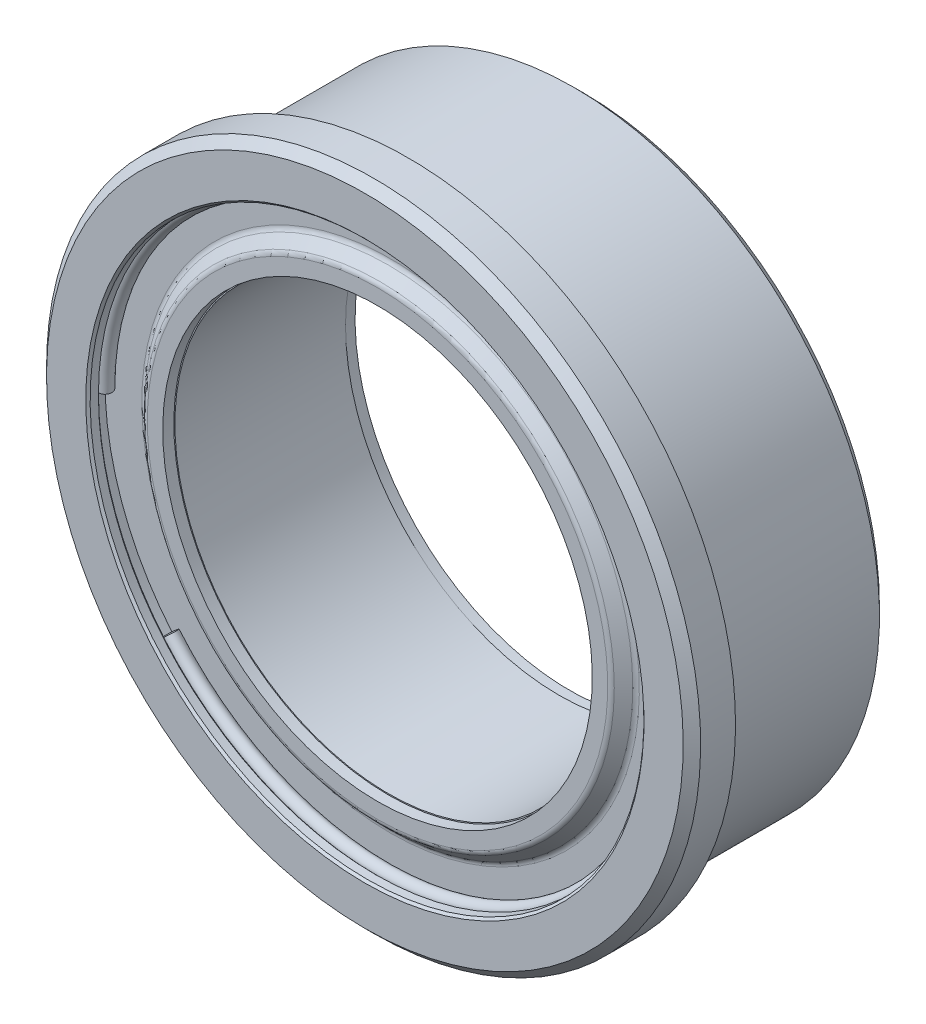
ISO-10303-21;
HEADER;
FILE_DESCRIPTION(('STEP AP214'),'2;1');
FILE_NAME('part.step','',(''),(''),'','','');
FILE_SCHEMA(('AUTOMOTIVE_DESIGN { 1 0 10303 214 1 1 1 1 }'));
ENDSEC;
DATA;
#1=APPLICATION_CONTEXT('core data for automotive mechanical design processes');
#2=APPLICATION_PROTOCOL_DEFINITION('international standard','automotive_design',2000,#1);
#3=PRODUCT_CONTEXT('',#1,'mechanical');
#4=PRODUCT('Part','Part','',(#3));
#5=PRODUCT_RELATED_PRODUCT_CATEGORY('part','',(#4));
#6=PRODUCT_DEFINITION_FORMATION('','',#4);
#7=PRODUCT_DEFINITION_CONTEXT('part definition',#1,'design');
#8=PRODUCT_DEFINITION('design','',#6,#7);
#9=PRODUCT_DEFINITION_SHAPE('','',#8);
#10=(LENGTH_UNIT() NAMED_UNIT(*) SI_UNIT(.MILLI.,.METRE.));
#11=(NAMED_UNIT(*) PLANE_ANGLE_UNIT() SI_UNIT($,.RADIAN.));
#12=(NAMED_UNIT(*) SI_UNIT($,.STERADIAN.) SOLID_ANGLE_UNIT());
#13=UNCERTAINTY_MEASURE_WITH_UNIT(LENGTH_MEASURE(1.E-05),#10,'distance_accuracy_value','');
#14=(GEOMETRIC_REPRESENTATION_CONTEXT(3) GLOBAL_UNCERTAINTY_ASSIGNED_CONTEXT((#13)) GLOBAL_UNIT_ASSIGNED_CONTEXT((#10,
#11,#12)) REPRESENTATION_CONTEXT('',''));
#15=CARTESIAN_POINT('',(0.,0.,0.));
#16=DIRECTION('',(0.,0.,1.));
#17=DIRECTION('',(1.,0.,0.));
#18=AXIS2_PLACEMENT_3D('',#15,#16,#17);
#19=CARTESIAN_POINT('',(0.,0.,4.71));
#20=DIRECTION('',(0.,0.,1.));
#21=DIRECTION('',(0.,-1.,0.));
#22=AXIS2_PLACEMENT_3D('',#19,#20,#21);
#23=CYLINDRICAL_SURFACE('',#22,4.9);
#24=CARTESIAN_POINT('',(0.,0.,0.544));
#25=DIRECTION('',(0.,0.,-1.));
#26=DIRECTION('',(-1.,0.,0.));
#27=AXIS2_PLACEMENT_3D('',#24,#25,#26);
#28=CIRCLE('',#27,4.9);
#29=CARTESIAN_POINT('',(-4.9,0.,0.544));
#30=VERTEX_POINT('',#29);
#31=EDGE_CURVE('E35',#30,#30,#28,.T.);
#32=ORIENTED_EDGE('',*,*,#31,.T.);
#33=EDGE_LOOP('',(#32));
#34=FACE_BOUND('',#33,.T.);
#35=CARTESIAN_POINT('',(0.,0.,4.456));
#36=DIRECTION('',(0.,0.,1.));
#37=DIRECTION('',(1.,0.,0.));
#38=AXIS2_PLACEMENT_3D('',#35,#36,#37);
#39=CIRCLE('',#38,4.9);
#40=CARTESIAN_POINT('',(4.9,0.,4.456));
#41=VERTEX_POINT('',#40);
#42=EDGE_CURVE('E42',#41,#41,#39,.T.);
#43=ORIENTED_EDGE('',*,*,#42,.T.);
#44=EDGE_LOOP('',(#43));
#45=FACE_BOUND('',#44,.T.);
#46=ADVANCED_FACE('F17',(#34,#45),#23,.F.);
#47=CARTESIAN_POINT('',(0.,0.,5.));
#48=DIRECTION('',(0.,-1.,0.));
#49=DIRECTION('',(0.,0.,-1.));
#50=AXIS2_PLACEMENT_3D('',#47,#48,#49);
#51=PLANE('',#50);
#52=CARTESIAN_POINT('',(-6.4,0.,0.44));
#53=DIRECTION('',(0.,1.,0.));
#54=DIRECTION('',(1.,0.,0.));
#55=AXIS2_PLACEMENT_3D('',#52,#53,#54);
#56=CIRCLE('',#55,0.16);
#57=CARTESIAN_POINT('',(-6.3443223563717,0.,0.59));
#58=VERTEX_POINT('',#57);
#59=CARTESIAN_POINT('',(-6.39029462827223,0.,0.280294628269161));
#60=VERTEX_POINT('',#59);
#61=EDGE_CURVE('E449',#58,#60,#56,.T.);
#62=ORIENTED_EDGE('',*,*,#61,.F.);
#63=DIRECTION('',(-1.,0.,0.));
#64=VECTOR('',#63,1.);
#65=CARTESIAN_POINT('',(0.,0.,0.59));
#66=LINE('',#65,#64);
#67=CARTESIAN_POINT('',(-6.4556776436283,0.,0.59));
#68=VERTEX_POINT('',#67);
#69=EDGE_CURVE('E360',#58,#68,#66,.T.);
#70=ORIENTED_EDGE('',*,*,#69,.T.);
#71=CARTESIAN_POINT('',(-6.4,0.,0.44));
#72=DIRECTION('',(0.,1.,0.));
#73=DIRECTION('',(1.,0.,0.));
#74=AXIS2_PLACEMENT_3D('',#71,#72,#73);
#75=CIRCLE('',#74,0.16);
#76=CARTESIAN_POINT('',(-6.55,0.,0.4956776436283));
#77=VERTEX_POINT('',#76);
#78=EDGE_CURVE('E288',#77,#68,#75,.T.);
#79=ORIENTED_EDGE('',*,*,#78,.F.);
#80=DIRECTION('',(0.,0.,1.));
#81=VECTOR('',#80,1.);
#82=CARTESIAN_POINT('',(-6.55,0.,0.59));
#83=LINE('',#82,#81);
#84=CARTESIAN_POINT('',(-6.55,0.,0.3843223563717));
#85=VERTEX_POINT('',#84);
#86=EDGE_CURVE('E412',#85,#77,#83,.T.);
#87=ORIENTED_EDGE('',*,*,#86,.F.);
#88=CARTESIAN_POINT('',(-6.4,0.,0.44));
#89=DIRECTION('',(0.,1.,0.));
#90=DIRECTION('',(1.,0.,0.));
#91=AXIS2_PLACEMENT_3D('',#88,#89,#90);
#92=CIRCLE('',#91,0.16);
#93=CARTESIAN_POINT('',(-6.4556776436283,0.,0.29));
#94=VERTEX_POINT('',#93);
#95=EDGE_CURVE('E415',#94,#85,#92,.T.);
#96=ORIENTED_EDGE('',*,*,#95,.F.);
#97=DIRECTION('',(-1.,0.,0.));
#98=VECTOR('',#97,1.);
#99=CARTESIAN_POINT('',(0.,0.,0.29));
#100=LINE('',#99,#98);
#101=CARTESIAN_POINT('',(-6.400000000005,0.,0.29));
#102=VERTEX_POINT('',#101);
#103=EDGE_CURVE('E361',#102,#94,#100,.T.);
#104=ORIENTED_EDGE('',*,*,#103,.F.);
#105=DIRECTION('',(-0.707106781186553,0.,0.707106781186542));
#106=VECTOR('',#105,1.);
#107=CARTESIAN_POINT('',(0.,0.,-6.10999999999989));
#108=LINE('',#107,#106);
#109=EDGE_CURVE('E333',#60,#102,#108,.T.);
#110=ORIENTED_EDGE('',*,*,#109,.F.);
#111=EDGE_LOOP('',(#62,#70,#79,#87,#96,#104,#110));
#112=FACE_BOUND('',#111,.T.);
#113=ADVANCED_FACE('F462',(#112),#51,.T.);
#114=CARTESIAN_POINT('',(0.,0.,0.));
#115=DIRECTION('',(0.64278760968653,-0.766044443118986,0.));
#116=DIRECTION('',(0.,0.,-1.));
#117=AXIS2_PLACEMENT_3D('',#114,#115,#116);
#118=PLANE('',#117);
#119=CARTESIAN_POINT('',(-4.90268443595996,-4.11384070199564,4.56));
#120=DIRECTION('',(0.642787609686818,-0.766044443118744,0.));
#121=DIRECTION('',(-0.766044443118744,-0.642787609686818,0.));
#122=AXIS2_PLACEMENT_3D('',#119,#120,#121);
#123=CIRCLE('',#122,0.16);
#124=CARTESIAN_POINT('',(-4.86003288645256,-4.07805180253481,4.41));
#125=VERTEX_POINT('',#124);
#126=CARTESIAN_POINT('',(-4.89524968987952,-4.10760220930164,4.71970537173084));
#127=VERTEX_POINT('',#126);
#128=EDGE_CURVE('E276',#125,#127,#123,.T.);
#129=ORIENTED_EDGE('',*,*,#128,.F.);
#130=DIRECTION('',(-0.766044443113703,-0.642787609692826,0.));
#131=VECTOR('',#130,1.);
#132=CARTESIAN_POINT('',(-3.30193986651628E-11,3.93509869838523E-11,4.41));
#133=LINE('',#132,#131);
#134=CARTESIAN_POINT('',(-4.94533598546709,-4.1496296014568,4.41));
#135=VERTEX_POINT('',#134);
#136=EDGE_CURVE('E378',#125,#135,#133,.T.);
#137=ORIENTED_EDGE('',*,*,#136,.T.);
#138=CARTESIAN_POINT('',(-4.90268443595996,-4.11384070199564,4.56));
#139=DIRECTION('',(0.642787609686818,-0.766044443118744,0.));
#140=DIRECTION('',(-0.766044443118744,-0.642787609686818,0.));
#141=AXIS2_PLACEMENT_3D('',#138,#139,#140);
#142=CIRCLE('',#141,0.16);
#143=CARTESIAN_POINT('',(-5.01759110242777,-4.21025884344866,4.5043223563717));
#144=VERTEX_POINT('',#143);
#145=EDGE_CURVE('E11',#144,#135,#142,.T.);
#146=ORIENTED_EDGE('',*,*,#145,.F.);
#147=DIRECTION('',(0.,0.,-1.));
#148=VECTOR('',#147,1.);
#149=CARTESIAN_POINT('',(-5.01759110242778,-4.21025884344866,4.41));
#150=LINE('',#149,#148);
#151=CARTESIAN_POINT('',(-5.01759110242777,-4.21025884344866,4.6156776436283));
#152=VERTEX_POINT('',#151);
#153=EDGE_CURVE('E328',#152,#144,#150,.T.);
#154=ORIENTED_EDGE('',*,*,#153,.F.);
#155=CARTESIAN_POINT('',(-4.90268443595996,-4.11384070199564,4.56));
#156=DIRECTION('',(0.642787609686818,-0.766044443118744,0.));
#157=DIRECTION('',(-0.766044443118744,-0.642787609686818,0.));
#158=AXIS2_PLACEMENT_3D('',#155,#156,#157);
#159=CIRCLE('',#158,0.16);
#160=CARTESIAN_POINT('',(-4.94533598546737,-4.14962960145647,4.71));
#161=VERTEX_POINT('',#160);
#162=EDGE_CURVE('E25',#161,#152,#159,.T.);
#163=ORIENTED_EDGE('',*,*,#162,.F.);
#164=DIRECTION('',(-0.766044443113703,-0.642787609692826,0.));
#165=VECTOR('',#164,1.);
#166=CARTESIAN_POINT('',(-3.30193986651628E-11,3.93509869838523E-11,4.71));
#167=LINE('',#166,#165);
#168=CARTESIAN_POINT('',(-4.90268443596611,-4.11384070199927,4.71000000001205));
#169=VERTEX_POINT('',#168);
#170=EDGE_CURVE('E294',#169,#161,#167,.T.);
#171=ORIENTED_EDGE('',*,*,#170,.F.);
#172=DIRECTION('',(-0.541675220415967,-0.454519477676485,-0.707106781186554));
#173=VECTOR('',#172,1.);
#174=CARTESIAN_POINT('',(-3.30193986651628E-11,3.93509869838523E-11,11.11));
#175=LINE('',#174,#173);
#176=EDGE_CURVE('E291',#127,#169,#175,.T.);
#177=ORIENTED_EDGE('',*,*,#176,.F.);
#178=EDGE_LOOP('',(#129,#137,#146,#154,#163,#171,#177));
#179=FACE_BOUND('',#178,.T.);
#180=ADVANCED_FACE('F292',(#179),#118,.F.);
#181=CARTESIAN_POINT('',(0.,0.,4.56));
#182=DIRECTION('',(0.,0.,1.));
#183=DIRECTION('',(0.,-1.,0.));
#184=AXIS2_PLACEMENT_3D('',#181,#182,#183);
#185=TOROIDAL_SURFACE('',#184,6.4,0.16);
#186=CARTESIAN_POINT('',(0.,0.,4.5043223563717));
#187=DIRECTION('',(0.,0.,1.));
#188=DIRECTION('',(1.,0.,0.));
#189=AXIS2_PLACEMENT_3D('',#186,#187,#188);
#190=CIRCLE('',#189,6.55);
#191=CARTESIAN_POINT('',(-6.55,0.,4.5043223563717));
#192=VERTEX_POINT('',#191);
#193=EDGE_CURVE('E329',#144,#192,#190,.T.);
#194=ORIENTED_EDGE('',*,*,#193,.F.);
#195=ORIENTED_EDGE('',*,*,#145,.T.);
#196=CARTESIAN_POINT('',(0.,0.,4.41));
#197=DIRECTION('',(0.,0.,1.));
#198=DIRECTION('',(1.,0.,0.));
#199=AXIS2_PLACEMENT_3D('',#196,#197,#198);
#200=CIRCLE('',#199,6.4556776436283);
#201=CARTESIAN_POINT('',(-6.4556776436283,0.,4.41));
#202=VERTEX_POINT('',#201);
#203=EDGE_CURVE('E400',#135,#202,#200,.T.);
#204=ORIENTED_EDGE('',*,*,#203,.T.);
#205=CARTESIAN_POINT('',(-6.4,0.,4.56));
#206=DIRECTION('',(0.,-1.,0.));
#207=DIRECTION('',(-1.,0.,0.));
#208=AXIS2_PLACEMENT_3D('',#205,#206,#207);
#209=CIRCLE('',#208,0.16);
#210=EDGE_CURVE('E511',#192,#202,#209,.T.);
#211=ORIENTED_EDGE('',*,*,#210,.F.);
#212=EDGE_LOOP('',(#194,#195,#204,#211));
#213=FACE_BOUND('',#212,.T.);
#214=ADVANCED_FACE('F590',(#213),#185,.T.);
#215=CARTESIAN_POINT('',(0.,0.,4.56));
#216=DIRECTION('',(0.,0.,1.));
#217=DIRECTION('',(0.,-1.,0.));
#218=AXIS2_PLACEMENT_3D('',#215,#216,#217);
#219=TOROIDAL_SURFACE('',#218,6.4,0.16);
#220=CARTESIAN_POINT('',(0.,0.,4.6156776436283));
#221=DIRECTION('',(0.,0.,-1.));
#222=DIRECTION('',(-1.,0.,0.));
#223=AXIS2_PLACEMENT_3D('',#220,#221,#222);
#224=CIRCLE('',#223,6.55);
#225=CARTESIAN_POINT('',(-6.55,0.,4.6156776436283));
#226=VERTEX_POINT('',#225);
#227=EDGE_CURVE('E324',#226,#152,#224,.T.);
#228=ORIENTED_EDGE('',*,*,#227,.F.);
#229=CARTESIAN_POINT('',(-6.4,0.,4.56));
#230=DIRECTION('',(0.,-1.,0.));
#231=DIRECTION('',(-1.,0.,0.));
#232=AXIS2_PLACEMENT_3D('',#229,#230,#231);
#233=CIRCLE('',#232,0.16);
#234=CARTESIAN_POINT('',(-6.4556776436283,0.,4.71));
#235=VERTEX_POINT('',#234);
#236=EDGE_CURVE('E512',#235,#226,#233,.T.);
#237=ORIENTED_EDGE('',*,*,#236,.F.);
#238=CARTESIAN_POINT('',(0.,0.,4.71));
#239=DIRECTION('',(0.,0.,1.));
#240=DIRECTION('',(1.,0.,0.));
#241=AXIS2_PLACEMENT_3D('',#238,#239,#240);
#242=CIRCLE('',#241,6.4556776436283);
#243=EDGE_CURVE('E431',#161,#235,#242,.T.);
#244=ORIENTED_EDGE('',*,*,#243,.F.);
#245=ORIENTED_EDGE('',*,*,#162,.T.);
#246=EDGE_LOOP('',(#228,#237,#244,#245));
#247=FACE_BOUND('',#246,.T.);
#248=ADVANCED_FACE('F593',(#247),#219,.T.);
#249=CARTESIAN_POINT('',(0.,0.,4.56));
#250=DIRECTION('',(0.,0.,1.));
#251=DIRECTION('',(0.,-1.,0.));
#252=AXIS2_PLACEMENT_3D('',#249,#250,#251);
#253=TOROIDAL_SURFACE('',#252,6.4,0.16);
#254=CARTESIAN_POINT('',(0.,0.,4.71970537173084));
#255=DIRECTION('',(0.,0.,-1.));
#256=DIRECTION('',(-1.,0.,0.));
#257=AXIS2_PLACEMENT_3D('',#254,#255,#256);
#258=CIRCLE('',#257,6.39029462826916);
#259=CARTESIAN_POINT('',(-6.39029462827226,0.,4.71970537173084));
#260=VERTEX_POINT('',#259);
#261=EDGE_CURVE('E281',#260,#127,#258,.T.);
#262=ORIENTED_EDGE('',*,*,#261,.F.);
#263=CARTESIAN_POINT('',(-6.4,0.,4.56));
#264=DIRECTION('',(0.,-1.,0.));
#265=DIRECTION('',(-1.,0.,0.));
#266=AXIS2_PLACEMENT_3D('',#263,#264,#265);
#267=CIRCLE('',#266,0.16);
#268=CARTESIAN_POINT('',(-6.3443223563717,0.,4.41));
#269=VERTEX_POINT('',#268);
#270=EDGE_CURVE('E535',#269,#260,#267,.T.);
#271=ORIENTED_EDGE('',*,*,#270,.F.);
#272=CARTESIAN_POINT('',(0.,0.,4.41));
#273=DIRECTION('',(0.,0.,-1.));
#274=DIRECTION('',(-1.,0.,0.));
#275=AXIS2_PLACEMENT_3D('',#272,#273,#274);
#276=CIRCLE('',#275,6.3443223563717);
#277=EDGE_CURVE('E283',#269,#125,#276,.T.);
#278=ORIENTED_EDGE('',*,*,#277,.T.);
#279=ORIENTED_EDGE('',*,*,#128,.T.);
#280=EDGE_LOOP('',(#262,#271,#278,#279));
#281=FACE_BOUND('',#280,.T.);
#282=ADVANCED_FACE('F278',(#281),#253,.T.);
#283=CARTESIAN_POINT('',(0.,0.,0.44));
#284=DIRECTION('',(0.,0.,-1.));
#285=DIRECTION('',(0.,-1.,0.));
#286=AXIS2_PLACEMENT_3D('',#283,#284,#285);
#287=TOROIDAL_SURFACE('',#286,6.4,0.16);
#288=CARTESIAN_POINT('',(0.,0.,0.4956776436283));
#289=DIRECTION('',(0.,0.,-1.));
#290=DIRECTION('',(-1.,0.,0.));
#291=AXIS2_PLACEMENT_3D('',#288,#289,#290);
#292=CIRCLE('',#291,6.55);
#293=CARTESIAN_POINT('',(-5.01759110242777,-4.21025884344866,0.4956776436283));
#294=VERTEX_POINT('',#293);
#295=EDGE_CURVE('E405',#77,#294,#292,.T.);
#296=ORIENTED_EDGE('',*,*,#295,.F.);
#297=ORIENTED_EDGE('',*,*,#78,.T.);
#298=CARTESIAN_POINT('',(0.,0.,0.59));
#299=DIRECTION('',(0.,0.,-1.));
#300=DIRECTION('',(-1.,0.,0.));
#301=AXIS2_PLACEMENT_3D('',#298,#299,#300);
#302=CIRCLE('',#301,6.4556776436283);
#303=CARTESIAN_POINT('',(-4.94533598546737,-4.14962960145647,0.59));
#304=VERTEX_POINT('',#303);
#305=EDGE_CURVE('E365',#68,#304,#302,.T.);
#306=ORIENTED_EDGE('',*,*,#305,.T.);
#307=CARTESIAN_POINT('',(-4.90268443595996,-4.11384070199564,0.44));
#308=DIRECTION('',(-0.642787609686818,0.766044443118744,0.));
#309=DIRECTION('',(0.766044443118744,0.642787609686818,0.));
#310=AXIS2_PLACEMENT_3D('',#307,#308,#309);
#311=CIRCLE('',#310,0.16);
#312=EDGE_CURVE('E475',#294,#304,#311,.T.);
#313=ORIENTED_EDGE('',*,*,#312,.F.);
#314=EDGE_LOOP('',(#296,#297,#306,#313));
#315=FACE_BOUND('',#314,.T.);
#316=ADVANCED_FACE('F599',(#315),#287,.T.);
#317=CARTESIAN_POINT('',(0.,0.,0.44));
#318=DIRECTION('',(0.,0.,-1.));
#319=DIRECTION('',(0.,-1.,0.));
#320=AXIS2_PLACEMENT_3D('',#317,#318,#319);
#321=TOROIDAL_SURFACE('',#320,6.4,0.16);
#322=CARTESIAN_POINT('',(0.,0.,0.3843223563717));
#323=DIRECTION('',(0.,0.,1.));
#324=DIRECTION('',(1.,0.,0.));
#325=AXIS2_PLACEMENT_3D('',#322,#323,#324);
#326=CIRCLE('',#325,6.55);
#327=CARTESIAN_POINT('',(-5.01759110242777,-4.21025884344866,0.3843223563717));
#328=VERTEX_POINT('',#327);
#329=EDGE_CURVE('E408',#328,#85,#326,.T.);
#330=ORIENTED_EDGE('',*,*,#329,.F.);
#331=CARTESIAN_POINT('',(-4.90268443595996,-4.11384070199564,0.44));
#332=DIRECTION('',(-0.642787609686818,0.766044443118744,0.));
#333=DIRECTION('',(0.766044443118744,0.642787609686818,0.));
#334=AXIS2_PLACEMENT_3D('',#331,#332,#333);
#335=CIRCLE('',#334,0.16);
#336=CARTESIAN_POINT('',(-4.94533598546737,-4.14962960145647,0.29));
#337=VERTEX_POINT('',#336);
#338=EDGE_CURVE('E476',#337,#328,#335,.T.);
#339=ORIENTED_EDGE('',*,*,#338,.F.);
#340=CARTESIAN_POINT('',(0.,0.,0.29));
#341=DIRECTION('',(0.,0.,-1.));
#342=DIRECTION('',(-1.,0.,0.));
#343=AXIS2_PLACEMENT_3D('',#340,#341,#342);
#344=CIRCLE('',#343,6.4556776436283);
#345=EDGE_CURVE('E366',#94,#337,#344,.T.);
#346=ORIENTED_EDGE('',*,*,#345,.F.);
#347=ORIENTED_EDGE('',*,*,#95,.T.);
#348=EDGE_LOOP('',(#330,#339,#346,#347));
#349=FACE_BOUND('',#348,.T.);
#350=ADVANCED_FACE('F457',(#349),#321,.T.);
#351=CARTESIAN_POINT('',(0.,0.,0.44));
#352=DIRECTION('',(0.,0.,-1.));
#353=DIRECTION('',(0.,-1.,0.));
#354=AXIS2_PLACEMENT_3D('',#351,#352,#353);
#355=TOROIDAL_SURFACE('',#354,6.4,0.16);
#356=CARTESIAN_POINT('',(0.,0.,0.280294628269161));
#357=DIRECTION('',(0.,0.,1.));
#358=DIRECTION('',(1.,0.,0.));
#359=AXIS2_PLACEMENT_3D('',#356,#357,#358);
#360=CIRCLE('',#359,6.39029462826916);
#361=CARTESIAN_POINT('',(-4.8952496898795,-4.10760220930162,0.280294628269161));
#362=VERTEX_POINT('',#361);
#363=EDGE_CURVE('E323',#362,#60,#360,.T.);
#364=ORIENTED_EDGE('',*,*,#363,.F.);
#365=CARTESIAN_POINT('',(-4.90268443595996,-4.11384070199564,0.44));
#366=DIRECTION('',(-0.642787609686818,0.766044443118744,0.));
#367=DIRECTION('',(0.766044443118744,0.642787609686818,0.));
#368=AXIS2_PLACEMENT_3D('',#365,#366,#367);
#369=CIRCLE('',#368,0.16);
#370=CARTESIAN_POINT('',(-4.86003288645284,-4.07805180253448,0.59));
#371=VERTEX_POINT('',#370);
#372=EDGE_CURVE('E494',#371,#362,#369,.T.);
#373=ORIENTED_EDGE('',*,*,#372,.F.);
#374=CARTESIAN_POINT('',(0.,0.,0.59));
#375=DIRECTION('',(0.,0.,1.));
#376=DIRECTION('',(1.,0.,0.));
#377=AXIS2_PLACEMENT_3D('',#374,#375,#376);
#378=CIRCLE('',#377,6.3443223563717);
#379=EDGE_CURVE('E356',#371,#58,#378,.T.);
#380=ORIENTED_EDGE('',*,*,#379,.T.);
#381=ORIENTED_EDGE('',*,*,#61,.T.);
#382=EDGE_LOOP('',(#364,#373,#380,#381));
#383=FACE_BOUND('',#382,.T.);
#384=ADVANCED_FACE('F605',(#383),#355,.T.);
#385=CARTESIAN_POINT('',(0.,0.,0.544));
#386=DIRECTION('',(0.,0.,-1.));
#387=DIRECTION('',(0.,-1.,0.));
#388=AXIS2_PLACEMENT_3D('',#385,#386,#387);
#389=PLANE('',#388);
#390=ORIENTED_EDGE('',*,*,#31,.F.);
#391=EDGE_LOOP('',(#390));
#392=FACE_BOUND('',#391,.T.);
#393=CARTESIAN_POINT('',(0.,0.,0.54400000001));
#394=DIRECTION('',(0.,0.,1.));
#395=DIRECTION('',(0.,-1.,0.));
#396=AXIS2_PLACEMENT_3D('',#393,#394,#395);
#397=CIRCLE('',#396,4.92500000001);
#398=CARTESIAN_POINT('',(0.,-4.92500000001,0.54400000001));
#399=VERTEX_POINT('',#398);
#400=EDGE_CURVE('E338',#399,#399,#397,.T.);
#401=ORIENTED_EDGE('',*,*,#400,.F.);
#402=EDGE_LOOP('',(#401));
#403=FACE_BOUND('',#402,.T.);
#404=ADVANCED_FACE('F606',(#392,#403),#389,.T.);
#405=CARTESIAN_POINT('',(0.,0.,4.456));
#406=DIRECTION('',(0.,0.,1.));
#407=DIRECTION('',(1.,0.,0.));
#408=AXIS2_PLACEMENT_3D('',#405,#406,#407);
#409=PLANE('',#408);
#410=ORIENTED_EDGE('',*,*,#42,.F.);
#411=EDGE_LOOP('',(#410));
#412=FACE_BOUND('',#411,.T.);
#413=CARTESIAN_POINT('',(0.,0.,4.45600000001));
#414=DIRECTION('',(0.,0.,1.));
#415=DIRECTION('',(0.,-1.,0.));
#416=AXIS2_PLACEMENT_3D('',#413,#414,#415);
#417=CIRCLE('',#416,4.92500000001);
#418=CARTESIAN_POINT('',(0.,-4.92500000001,4.45600000001));
#419=VERTEX_POINT('',#418);
#420=EDGE_CURVE('E369',#419,#419,#417,.T.);
#421=ORIENTED_EDGE('',*,*,#420,.T.);
#422=EDGE_LOOP('',(#421));
#423=FACE_BOUND('',#422,.T.);
#424=ADVANCED_FACE('F609',(#412,#423),#409,.T.);
#425=CARTESIAN_POINT('',(0.,0.,0.59));
#426=DIRECTION('',(0.,0.,-1.));
#427=DIRECTION('',(0.,-1.,0.));
#428=AXIS2_PLACEMENT_3D('',#425,#426,#427);
#429=PLANE('',#428);
#430=CARTESIAN_POINT('',(0.,0.,0.59000000001));
#431=DIRECTION('',(0.,0.,1.));
#432=DIRECTION('',(0.,1.,0.));
#433=AXIS2_PLACEMENT_3D('',#430,#431,#432);
#434=CIRCLE('',#433,5.69404536550054);
#435=CARTESIAN_POINT('',(0.,5.69404536550054,0.59000000001));
#436=VERTEX_POINT('',#435);
#437=EDGE_CURVE('E396',#436,#436,#434,.T.);
#438=ORIENTED_EDGE('',*,*,#437,.T.);
#439=EDGE_LOOP('',(#438));
#440=FACE_BOUND('',#439,.T.);
#441=CARTESIAN_POINT('',(0.,0.,0.59000000001));
#442=DIRECTION('',(0.,0.,1.));
#443=DIRECTION('',(0.,-1.,0.));
#444=AXIS2_PLACEMENT_3D('',#441,#442,#443);
#445=CIRCLE('',#444,6.55000000001);
#446=CARTESIAN_POINT('',(0.,-6.55000000001,0.59000000001));
#447=VERTEX_POINT('',#446);
#448=EDGE_CURVE('E416',#447,#447,#445,.T.);
#449=ORIENTED_EDGE('',*,*,#448,.F.);
#450=EDGE_LOOP('',(#449));
#451=FACE_BOUND('',#450,.T.);
#452=DIRECTION('',(0.766044443113703,0.642787609692826,0.));
#453=VECTOR('',#452,1.);
#454=CARTESIAN_POINT('',(-3.30193986651628E-11,3.93509869838523E-11,0.59));
#455=LINE('',#454,#453);
#456=EDGE_CURVE('E498',#304,#371,#455,.T.);
#457=ORIENTED_EDGE('',*,*,#456,.F.);
#458=ORIENTED_EDGE('',*,*,#305,.F.);
#459=ORIENTED_EDGE('',*,*,#69,.F.);
#460=ORIENTED_EDGE('',*,*,#379,.F.);
#461=EDGE_LOOP('',(#457,#458,#459,#460));
#462=FACE_BOUND('',#461,.T.);
#463=ADVANCED_FACE('F613',(#440,#451,#462),#429,.T.);
#464=CARTESIAN_POINT('',(0.,0.,0.29));
#465=DIRECTION('',(0.,0.,-1.));
#466=DIRECTION('',(0.,-1.,0.));
#467=AXIS2_PLACEMENT_3D('',#464,#465,#466);
#468=PLANE('',#467);
#469=ORIENTED_EDGE('',*,*,#345,.T.);
#470=DIRECTION('',(0.766044443113703,0.642787609692826,0.));
#471=VECTOR('',#470,1.);
#472=CARTESIAN_POINT('',(-3.30193986651628E-11,3.93509869838523E-11,0.29));
#473=LINE('',#472,#471);
#474=CARTESIAN_POINT('',(-4.90268443597151,-4.11384070200379,0.289999999995912));
#475=VERTEX_POINT('',#474);
#476=EDGE_CURVE('E482',#337,#475,#473,.T.);
#477=ORIENTED_EDGE('',*,*,#476,.T.);
#478=CARTESIAN_POINT('',(0.,0.,0.290000000010001));
#479=DIRECTION('',(0.,0.,-1.));
#480=DIRECTION('',(0.,1.,0.));
#481=AXIS2_PLACEMENT_3D('',#478,#479,#480);
#482=CIRCLE('',#481,6.40000000001);
#483=EDGE_CURVE('E319',#475,#102,#482,.T.);
#484=ORIENTED_EDGE('',*,*,#483,.T.);
#485=ORIENTED_EDGE('',*,*,#103,.T.);
#486=EDGE_LOOP('',(#469,#477,#484,#485));
#487=FACE_BOUND('',#486,.T.);
#488=CARTESIAN_POINT('',(0.,0.,0.290000000010001));
#489=DIRECTION('',(0.,0.,1.));
#490=DIRECTION('',(0.,-1.,0.));
#491=AXIS2_PLACEMENT_3D('',#488,#489,#490);
#492=CIRCLE('',#491,6.55000000001);
#493=CARTESIAN_POINT('',(0.,-6.55000000001,0.290000000010001));
#494=VERTEX_POINT('',#493);
#495=EDGE_CURVE('E419',#494,#494,#492,.T.);
#496=ORIENTED_EDGE('',*,*,#495,.T.);
#497=EDGE_LOOP('',(#496));
#498=FACE_BOUND('',#497,.T.);
#499=ADVANCED_FACE('F617',(#487,#498),#468,.F.);
#500=CARTESIAN_POINT('',(0.,0.,4.41));
#501=DIRECTION('',(0.,0.,1.));
#502=DIRECTION('',(1.,0.,0.));
#503=AXIS2_PLACEMENT_3D('',#500,#501,#502);
#504=PLANE('',#503);
#505=CARTESIAN_POINT('',(0.,0.,4.41000000001));
#506=DIRECTION('',(0.,0.,-1.));
#507=DIRECTION('',(0.,-1.,0.));
#508=AXIS2_PLACEMENT_3D('',#505,#506,#507);
#509=CIRCLE('',#508,5.70404536550054);
#510=CARTESIAN_POINT('',(0.,-5.70404536550054,4.41000000001));
#511=VERTEX_POINT('',#510);
#512=EDGE_CURVE('E372',#511,#511,#509,.T.);
#513=ORIENTED_EDGE('',*,*,#512,.T.);
#514=EDGE_LOOP('',(#513));
#515=FACE_BOUND('',#514,.T.);
#516=CARTESIAN_POINT('',(0.,0.,4.41000000001));
#517=DIRECTION('',(0.,0.,1.));
#518=DIRECTION('',(0.,-1.,0.));
#519=AXIS2_PLACEMENT_3D('',#516,#517,#518);
#520=CIRCLE('',#519,6.55000000001);
#521=CARTESIAN_POINT('',(0.,-6.55000000001,4.41000000001));
#522=VERTEX_POINT('',#521);
#523=EDGE_CURVE('E389',#522,#522,#520,.T.);
#524=ORIENTED_EDGE('',*,*,#523,.T.);
#525=EDGE_LOOP('',(#524));
#526=FACE_BOUND('',#525,.T.);
#527=DIRECTION('',(1.,0.,0.));
#528=VECTOR('',#527,1.);
#529=CARTESIAN_POINT('',(0.,0.,4.41));
#530=LINE('',#529,#528);
#531=EDGE_CURVE('E529',#202,#269,#530,.T.);
#532=ORIENTED_EDGE('',*,*,#531,.F.);
#533=ORIENTED_EDGE('',*,*,#203,.F.);
#534=ORIENTED_EDGE('',*,*,#136,.F.);
#535=ORIENTED_EDGE('',*,*,#277,.F.);
#536=EDGE_LOOP('',(#532,#533,#534,#535));
#537=FACE_BOUND('',#536,.T.);
#538=ADVANCED_FACE('F664',(#515,#526,#537),#504,.T.);
#539=CARTESIAN_POINT('',(0.,0.,4.71));
#540=DIRECTION('',(0.,0.,1.));
#541=DIRECTION('',(1.,0.,0.));
#542=AXIS2_PLACEMENT_3D('',#539,#540,#541);
#543=PLANE('',#542);
#544=ORIENTED_EDGE('',*,*,#243,.T.);
#545=DIRECTION('',(1.,0.,0.));
#546=VECTOR('',#545,1.);
#547=CARTESIAN_POINT('',(0.,0.,4.71));
#548=LINE('',#547,#546);
#549=CARTESIAN_POINT('',(-6.40000000001,0.,4.71000000002));
#550=VERTEX_POINT('',#549);
#551=EDGE_CURVE('E506',#235,#550,#548,.T.);
#552=ORIENTED_EDGE('',*,*,#551,.T.);
#553=CARTESIAN_POINT('',(0.,0.,4.71000000001));
#554=DIRECTION('',(0.,0.,1.));
#555=DIRECTION('',(0.,-1.,0.));
#556=AXIS2_PLACEMENT_3D('',#553,#554,#555);
#557=CIRCLE('',#556,6.40000000001001);
#558=EDGE_CURVE('E305',#550,#169,#557,.T.);
#559=ORIENTED_EDGE('',*,*,#558,.T.);
#560=ORIENTED_EDGE('',*,*,#170,.T.);
#561=EDGE_LOOP('',(#544,#552,#559,#560));
#562=FACE_BOUND('',#561,.T.);
#563=CARTESIAN_POINT('',(0.,0.,4.71000000001));
#564=DIRECTION('',(0.,0.,1.));
#565=DIRECTION('',(0.,-1.,0.));
#566=AXIS2_PLACEMENT_3D('',#563,#564,#565);
#567=CIRCLE('',#566,6.55000000001);
#568=CARTESIAN_POINT('',(0.,-6.55000000001,4.71000000001));
#569=VERTEX_POINT('',#568);
#570=EDGE_CURVE('E420',#569,#569,#567,.T.);
#571=ORIENTED_EDGE('',*,*,#570,.F.);
#572=EDGE_LOOP('',(#571));
#573=FACE_BOUND('',#572,.T.);
#574=ADVANCED_FACE('F623',(#562,#573),#543,.F.);
#575=CARTESIAN_POINT('',(7.,0.,3.7));
#576=DIRECTION('',(0.,0.,1.));
#577=DIRECTION('',(1.,0.,0.));
#578=AXIS2_PLACEMENT_3D('',#575,#576,#577);
#579=PLANE('',#578);
#580=CARTESIAN_POINT('',(0.,0.,3.70000000001));
#581=DIRECTION('',(0.,0.,1.));
#582=DIRECTION('',(0.,-1.,0.));
#583=AXIS2_PLACEMENT_3D('',#580,#581,#582);
#584=CIRCLE('',#583,6.80000000001);
#585=CARTESIAN_POINT('',(0.,-6.80000000001,3.70000000001));
#586=VERTEX_POINT('',#585);
#587=EDGE_CURVE('E388',#586,#586,#584,.T.);
#588=ORIENTED_EDGE('',*,*,#587,.F.);
#589=EDGE_LOOP('',(#588));
#590=FACE_BOUND('',#589,.T.);
#591=CARTESIAN_POINT('',(0.,0.,3.70000000001));
#592=DIRECTION('',(0.,0.,1.));
#593=DIRECTION('',(0.,-1.,0.));
#594=AXIS2_PLACEMENT_3D('',#591,#592,#593);
#595=CIRCLE('',#594,7.00000000001);
#596=CARTESIAN_POINT('',(0.,-7.00000000001,3.70000000001));
#597=VERTEX_POINT('',#596);
#598=EDGE_CURVE('E428',#597,#597,#595,.T.);
#599=ORIENTED_EDGE('',*,*,#598,.T.);
#600=EDGE_LOOP('',(#599));
#601=FACE_BOUND('',#600,.T.);
#602=ADVANCED_FACE('F619',(#590,#601),#579,.T.);
#603=CARTESIAN_POINT('',(0.,0.,5.));
#604=DIRECTION('',(0.,0.,1.));
#605=DIRECTION('',(1.,0.,0.));
#606=AXIS2_PLACEMENT_3D('',#603,#604,#605);
#607=PLANE('',#606);
#608=CARTESIAN_POINT('',(0.,0.,5.00000000001));
#609=DIRECTION('',(0.,0.,-1.));
#610=DIRECTION('',(0.,-1.,0.));
#611=AXIS2_PLACEMENT_3D('',#608,#609,#610);
#612=CIRCLE('',#611,6.40000000001001);
#613=CARTESIAN_POINT('',(0.,-6.40000000001001,5.00000000001));
#614=VERTEX_POINT('',#613);
#615=EDGE_CURVE('E523',#614,#614,#612,.T.);
#616=ORIENTED_EDGE('',*,*,#615,.T.);
#617=EDGE_LOOP('',(#616));
#618=FACE_BOUND('',#617,.T.);
#619=CARTESIAN_POINT('',(0.,0.,5.00000000001));
#620=DIRECTION('',(0.,0.,1.));
#621=DIRECTION('',(0.,-1.,0.));
#622=AXIS2_PLACEMENT_3D('',#619,#620,#621);
#623=CIRCLE('',#622,7.30000000001001);
#624=CARTESIAN_POINT('',(0.,-7.30000000001001,5.00000000001));
#625=VERTEX_POINT('',#624);
#626=EDGE_CURVE('E353',#625,#625,#623,.T.);
#627=ORIENTED_EDGE('',*,*,#626,.T.);
#628=EDGE_LOOP('',(#627));
#629=FACE_BOUND('',#628,.T.);
#630=ADVANCED_FACE('F622',(#618,#629),#607,.T.);
#631=CARTESIAN_POINT('',(0.,0.,4.));
#632=DIRECTION('',(0.,0.,1.));
#633=DIRECTION('',(1.,0.,0.));
#634=AXIS2_PLACEMENT_3D('',#631,#632,#633);
#635=PLANE('',#634);
#636=CARTESIAN_POINT('',(0.,0.,4.00000000001));
#637=DIRECTION('',(0.,0.,1.));
#638=DIRECTION('',(0.,-1.,0.));
#639=AXIS2_PLACEMENT_3D('',#636,#637,#638);
#640=CIRCLE('',#639,6.80000000001);
#641=CARTESIAN_POINT('',(0.,-6.80000000001,4.00000000001));
#642=VERTEX_POINT('',#641);
#643=EDGE_CURVE('E385',#642,#642,#640,.T.);
#644=ORIENTED_EDGE('',*,*,#643,.T.);
#645=EDGE_LOOP('',(#644));
#646=FACE_BOUND('',#645,.T.);
#647=CARTESIAN_POINT('',(0.,0.,4.00000000001));
#648=DIRECTION('',(0.,0.,1.));
#649=DIRECTION('',(0.,-1.,0.));
#650=AXIS2_PLACEMENT_3D('',#647,#648,#649);
#651=CIRCLE('',#650,7.50000000001);
#652=CARTESIAN_POINT('',(0.,-7.50000000001,4.00000000001));
#653=VERTEX_POINT('',#652);
#654=EDGE_CURVE('E427',#653,#653,#651,.T.);
#655=ORIENTED_EDGE('',*,*,#654,.F.);
#656=EDGE_LOOP('',(#655));
#657=FACE_BOUND('',#656,.T.);
#658=ADVANCED_FACE('F576',(#646,#657),#635,.F.);
#659=CARTESIAN_POINT('',(0.,0.,0.));
#660=DIRECTION('',(0.,0.,1.));
#661=DIRECTION('',(1.,0.,0.));
#662=AXIS2_PLACEMENT_3D('',#659,#660,#661);
#663=PLANE('',#662);
#664=CARTESIAN_POINT('',(0.,0.,0.));
#665=DIRECTION('',(0.,0.,1.));
#666=DIRECTION('',(0.,-1.,0.));
#667=AXIS2_PLACEMENT_3D('',#664,#665,#666);
#668=CIRCLE('',#667,6.40000000001);
#669=CARTESIAN_POINT('',(0.,-6.40000000001,0.));
#670=VERTEX_POINT('',#669);
#671=EDGE_CURVE('E314',#670,#670,#668,.T.);
#672=ORIENTED_EDGE('',*,*,#671,.T.);
#673=EDGE_LOOP('',(#672));
#674=FACE_BOUND('',#673,.T.);
#675=CARTESIAN_POINT('',(0.,0.,0.));
#676=DIRECTION('',(0.,0.,-1.));
#677=DIRECTION('',(0.,-1.,0.));
#678=AXIS2_PLACEMENT_3D('',#675,#676,#677);
#679=CIRCLE('',#678,6.80000000001);
#680=CARTESIAN_POINT('',(0.,-6.80000000001,0.));
#681=VERTEX_POINT('',#680);
#682=EDGE_CURVE('E349',#681,#681,#679,.T.);
#683=ORIENTED_EDGE('',*,*,#682,.T.);
#684=EDGE_LOOP('',(#683));
#685=FACE_BOUND('',#684,.T.);
#686=ADVANCED_FACE('F564',(#674,#685),#663,.F.);
#687=CARTESIAN_POINT('',(0.,0.,4.71));
#688=DIRECTION('',(0.,0.,1.));
#689=DIRECTION('',(1.,0.,0.));
#690=AXIS2_PLACEMENT_3D('',#687,#688,#689);
#691=PLANE('',#690);
#692=CARTESIAN_POINT('',(0.,0.,4.71000000001));
#693=DIRECTION('',(0.,0.,1.));
#694=DIRECTION('',(0.,-1.,0.));
#695=AXIS2_PLACEMENT_3D('',#692,#693,#694);
#696=CIRCLE('',#695,4.92500000001);
#697=CARTESIAN_POINT('',(0.,-4.92500000001,4.71000000001));
#698=VERTEX_POINT('',#697);
#699=EDGE_CURVE('E341',#698,#698,#696,.T.);
#700=ORIENTED_EDGE('',*,*,#699,.F.);
#701=EDGE_LOOP('',(#700));
#702=FACE_BOUND('',#701,.T.);
#703=CARTESIAN_POINT('',(0.,0.,4.71000000001));
#704=DIRECTION('',(0.,0.,1.));
#705=DIRECTION('',(0.,-1.,0.));
#706=AXIS2_PLACEMENT_3D('',#703,#704,#705);
#707=CIRCLE('',#706,5.27978129678862);
#708=CARTESIAN_POINT('',(0.,-5.27978129678862,4.71000000001));
#709=VERTEX_POINT('',#708);
#710=EDGE_CURVE('E381',#709,#709,#707,.T.);
#711=ORIENTED_EDGE('',*,*,#710,.T.);
#712=EDGE_LOOP('',(#711));
#713=FACE_BOUND('',#712,.T.);
#714=ADVANCED_FACE('F561',(#702,#713),#691,.T.);
#715=CARTESIAN_POINT('',(0.,0.,0.3));
#716=DIRECTION('',(0.,0.,-1.));
#717=DIRECTION('',(0.,-1.,0.));
#718=AXIS2_PLACEMENT_3D('',#715,#716,#717);
#719=PLANE('',#718);
#720=CARTESIAN_POINT('',(0.,0.,0.30000000001));
#721=DIRECTION('',(0.,0.,1.));
#722=DIRECTION('',(0.,1.,0.));
#723=AXIS2_PLACEMENT_3D('',#720,#721,#722);
#724=CIRCLE('',#723,4.92500000001);
#725=CARTESIAN_POINT('',(0.,4.92500000001,0.30000000001));
#726=VERTEX_POINT('',#725);
#727=EDGE_CURVE('E342',#726,#726,#724,.T.);
#728=ORIENTED_EDGE('',*,*,#727,.T.);
#729=EDGE_LOOP('',(#728));
#730=FACE_BOUND('',#729,.T.);
#731=CARTESIAN_POINT('',(0.,0.,0.30000000001));
#732=DIRECTION('',(0.,0.,-1.));
#733=DIRECTION('',(0.,1.,0.));
#734=AXIS2_PLACEMENT_3D('',#731,#732,#733);
#735=CIRCLE('',#734,5.27978129678861);
#736=CARTESIAN_POINT('',(0.,5.27978129678861,0.30000000001));
#737=VERTEX_POINT('',#736);
#738=EDGE_CURVE('E390',#737,#737,#735,.T.);
#739=ORIENTED_EDGE('',*,*,#738,.T.);
#740=EDGE_LOOP('',(#739));
#741=FACE_BOUND('',#740,.T.);
#742=ADVANCED_FACE('F563',(#730,#741),#719,.T.);
#743=CARTESIAN_POINT('',(0.,0.,4.));
#744=DIRECTION('',(0.,0.,-1.));
#745=DIRECTION('',(0.,1.,0.));
#746=AXIS2_PLACEMENT_3D('',#743,#744,#745);
#747=CYLINDRICAL_SURFACE('',#746,7.);
#748=ORIENTED_EDGE('',*,*,#598,.F.);
#749=EDGE_LOOP('',(#748));
#750=FACE_BOUND('',#749,.T.);
#751=CARTESIAN_POINT('',(0.,0.,0.200000000009998));
#752=DIRECTION('',(0.,0.,1.));
#753=DIRECTION('',(0.,-1.,0.));
#754=AXIS2_PLACEMENT_3D('',#751,#752,#753);
#755=CIRCLE('',#754,7.00000000001);
#756=CARTESIAN_POINT('',(0.,-7.00000000001,0.200000000009998));
#757=VERTEX_POINT('',#756);
#758=EDGE_CURVE('E348',#757,#757,#755,.T.);
#759=ORIENTED_EDGE('',*,*,#758,.T.);
#760=EDGE_LOOP('',(#759));
#761=FACE_BOUND('',#760,.T.);
#762=ADVANCED_FACE('F573',(#750,#761),#747,.T.);
#763=CARTESIAN_POINT('',(0.,0.,31.2132034355964));
#764=DIRECTION('',(0.,0.,-1.));
#765=DIRECTION('',(0.,1.,0.));
#766=AXIS2_PLACEMENT_3D('',#763,#764,#765);
#767=CYLINDRICAL_SURFACE('',#766,7.5);
#768=CARTESIAN_POINT('',(0.,0.,4.80000000001));
#769=DIRECTION('',(0.,0.,-1.));
#770=DIRECTION('',(0.,-1.,0.));
#771=AXIS2_PLACEMENT_3D('',#768,#769,#770);
#772=CIRCLE('',#771,7.50000000001);
#773=CARTESIAN_POINT('',(0.,-7.50000000001,4.80000000001));
#774=VERTEX_POINT('',#773);
#775=EDGE_CURVE('E352',#774,#774,#772,.T.);
#776=ORIENTED_EDGE('',*,*,#775,.T.);
#777=EDGE_LOOP('',(#776));
#778=FACE_BOUND('',#777,.T.);
#779=ORIENTED_EDGE('',*,*,#654,.T.);
#780=EDGE_LOOP('',(#779));
#781=FACE_BOUND('',#780,.T.);
#782=ADVANCED_FACE('F637',(#778,#781),#767,.T.);
#783=CARTESIAN_POINT('',(0.,0.,4.71));
#784=DIRECTION('',(0.,0.,1.));
#785=DIRECTION('',(0.,-1.,0.));
#786=AXIS2_PLACEMENT_3D('',#783,#784,#785);
#787=CYLINDRICAL_SURFACE('',#786,6.35);
#788=CARTESIAN_POINT('',(0.,0.,4.76000000001001));
#789=DIRECTION('',(0.,0.,-1.));
#790=DIRECTION('',(0.,-1.,0.));
#791=AXIS2_PLACEMENT_3D('',#788,#789,#790);
#792=CIRCLE('',#791,6.35000000001);
#793=CARTESIAN_POINT('',(0.,-6.35000000001,4.76000000001001));
#794=VERTEX_POINT('',#793);
#795=EDGE_CURVE('E298',#794,#794,#792,.T.);
#796=ORIENTED_EDGE('',*,*,#795,.T.);
#797=EDGE_LOOP('',(#796));
#798=FACE_BOUND('',#797,.T.);
#799=CARTESIAN_POINT('',(0.,0.,4.95000000001));
#800=DIRECTION('',(0.,0.,1.));
#801=DIRECTION('',(0.,-1.,0.));
#802=AXIS2_PLACEMENT_3D('',#799,#800,#801);
#803=CIRCLE('',#802,6.35000000001);
#804=CARTESIAN_POINT('',(0.,-6.35000000001,4.95000000001));
#805=VERTEX_POINT('',#804);
#806=EDGE_CURVE('E311',#805,#805,#803,.T.);
#807=ORIENTED_EDGE('',*,*,#806,.T.);
#808=EDGE_LOOP('',(#807));
#809=FACE_BOUND('',#808,.T.);
#810=ADVANCED_FACE('F639',(#798,#809),#787,.F.);
#811=CARTESIAN_POINT('',(0.,0.,0.3));
#812=DIRECTION('',(0.,0.,-1.));
#813=DIRECTION('',(0.,1.,0.));
#814=AXIS2_PLACEMENT_3D('',#811,#812,#813);
#815=CYLINDRICAL_SURFACE('',#814,6.35);
#816=CARTESIAN_POINT('',(0.,0.,0.240000000010004));
#817=DIRECTION('',(0.,0.,1.));
#818=DIRECTION('',(0.,1.,0.));
#819=AXIS2_PLACEMENT_3D('',#816,#817,#818);
#820=CIRCLE('',#819,6.35000000001);
#821=CARTESIAN_POINT('',(0.,6.35000000001,0.240000000010004));
#822=VERTEX_POINT('',#821);
#823=EDGE_CURVE('E337',#822,#822,#820,.T.);
#824=ORIENTED_EDGE('',*,*,#823,.T.);
#825=EDGE_LOOP('',(#824));
#826=FACE_BOUND('',#825,.T.);
#827=CARTESIAN_POINT('',(0.,0.,0.0500000000099962));
#828=DIRECTION('',(0.,0.,-1.));
#829=DIRECTION('',(0.,-1.,0.));
#830=AXIS2_PLACEMENT_3D('',#827,#828,#829);
#831=CIRCLE('',#830,6.35000000001);
#832=CARTESIAN_POINT('',(0.,-6.35000000001,0.0500000000099962));
#833=VERTEX_POINT('',#832);
#834=EDGE_CURVE('E345',#833,#833,#831,.T.);
#835=ORIENTED_EDGE('',*,*,#834,.T.);
#836=EDGE_LOOP('',(#835));
#837=FACE_BOUND('',#836,.T.);
#838=ADVANCED_FACE('F647',(#826,#837),#815,.F.);
#839=CARTESIAN_POINT('',(0.,0.,0.));
#840=DIRECTION('',(0.,0.,1.));
#841=DIRECTION('',(0.,-1.,0.));
#842=AXIS2_PLACEMENT_3D('',#839,#840,#841);
#843=CYLINDRICAL_SURFACE('',#842,6.8);
#844=ORIENTED_EDGE('',*,*,#587,.T.);
#845=EDGE_LOOP('',(#844));
#846=FACE_BOUND('',#845,.T.);
#847=ORIENTED_EDGE('',*,*,#643,.F.);
#848=EDGE_LOOP('',(#847));
#849=FACE_BOUND('',#848,.T.);
#850=ADVANCED_FACE('F711',(#846,#849),#843,.T.);
#851=CARTESIAN_POINT('',(0.,0.,4.41));
#852=DIRECTION('',(0.,0.,1.));
#853=DIRECTION('',(0.,-1.,0.));
#854=AXIS2_PLACEMENT_3D('',#851,#852,#853);
#855=CYLINDRICAL_SURFACE('',#854,6.55);
#856=ORIENTED_EDGE('',*,*,#523,.F.);
#857=EDGE_LOOP('',(#856));
#858=FACE_BOUND('',#857,.T.);
#859=ORIENTED_EDGE('',*,*,#570,.T.);
#860=EDGE_LOOP('',(#859));
#861=FACE_BOUND('',#860,.T.);
#862=ORIENTED_EDGE('',*,*,#193,.T.);
#863=DIRECTION('',(0.,0.,1.));
#864=VECTOR('',#863,1.);
#865=CARTESIAN_POINT('',(-6.55,0.,4.41));
#866=LINE('',#865,#864);
#867=EDGE_CURVE('E507',#192,#226,#866,.T.);
#868=ORIENTED_EDGE('',*,*,#867,.T.);
#869=ORIENTED_EDGE('',*,*,#227,.T.);
#870=ORIENTED_EDGE('',*,*,#153,.T.);
#871=EDGE_LOOP('',(#862,#868,#869,#870));
#872=FACE_BOUND('',#871,.T.);
#873=ADVANCED_FACE('F682',(#858,#861,#872),#855,.F.);
#874=CARTESIAN_POINT('',(0.,0.,0.59));
#875=DIRECTION('',(0.,0.,-1.));
#876=DIRECTION('',(0.,1.,0.));
#877=AXIS2_PLACEMENT_3D('',#874,#875,#876);
#878=CYLINDRICAL_SURFACE('',#877,6.55);
#879=ORIENTED_EDGE('',*,*,#448,.T.);
#880=EDGE_LOOP('',(#879));
#881=FACE_BOUND('',#880,.T.);
#882=ORIENTED_EDGE('',*,*,#495,.F.);
#883=EDGE_LOOP('',(#882));
#884=FACE_BOUND('',#883,.T.);
#885=ORIENTED_EDGE('',*,*,#295,.T.);
#886=DIRECTION('',(0.,0.,-1.));
#887=VECTOR('',#886,1.);
#888=CARTESIAN_POINT('',(-5.01759110242778,-4.21025884344866,0.59));
#889=LINE('',#888,#887);
#890=EDGE_CURVE('E469',#294,#328,#889,.T.);
#891=ORIENTED_EDGE('',*,*,#890,.T.);
#892=ORIENTED_EDGE('',*,*,#329,.T.);
#893=ORIENTED_EDGE('',*,*,#86,.T.);
#894=EDGE_LOOP('',(#885,#891,#892,#893));
#895=FACE_BOUND('',#894,.T.);
#896=ADVANCED_FACE('F467',(#881,#884,#895),#878,.F.);
#897=CARTESIAN_POINT('',(0.,0.,0.6));
#898=DIRECTION('',(0.,0.,1.));
#899=DIRECTION('',(0.,-1.,0.));
#900=AXIS2_PLACEMENT_3D('',#897,#898,#899);
#901=CONICAL_SURFACE('',#900,5.64191333113458,0.785398163397443);
#902=CARTESIAN_POINT('',(0.,0.,0.343933982832018));
#903=DIRECTION('',(0.,0.,1.));
#904=DIRECTION('',(0.,1.,0.));
#905=AXIS2_PLACEMENT_3D('',#902,#903,#904);
#906=CIRCLE('',#905,5.3858473139666);
#907=CARTESIAN_POINT('',(0.,5.3858473139666,0.343933982832018));
#908=VERTEX_POINT('',#907);
#909=EDGE_CURVE('E393',#908,#908,#906,.T.);
#910=ORIENTED_EDGE('',*,*,#909,.T.);
#911=EDGE_LOOP('',(#910));
#912=FACE_BOUND('',#911,.T.);
#913=CARTESIAN_POINT('',(0.,0.,0.546066017187981));
#914=DIRECTION('',(0.,0.,-1.));
#915=DIRECTION('',(0.,-1.,0.));
#916=AXIS2_PLACEMENT_3D('',#913,#914,#915);
#917=CIRCLE('',#916,5.58797934832256);
#918=CARTESIAN_POINT('',(0.,-5.58797934832256,0.546066017187981));
#919=VERTEX_POINT('',#918);
#920=EDGE_CURVE('E399',#919,#919,#917,.T.);
#921=ORIENTED_EDGE('',*,*,#920,.T.);
#922=EDGE_LOOP('',(#921));
#923=FACE_BOUND('',#922,.T.);
#924=ADVANCED_FACE('F681',(#912,#923),#901,.T.);
#925=CARTESIAN_POINT('',(0.,0.,4.71));
#926=DIRECTION('',(0.,0.,-1.));
#927=DIRECTION('',(0.,1.,0.));
#928=AXIS2_PLACEMENT_3D('',#925,#926,#927);
#929=CONICAL_SURFACE('',#928,5.34191333113458,0.785398163397446);
#930=CARTESIAN_POINT('',(0.,0.,4.66606601718798));
#931=DIRECTION('',(0.,0.,-1.));
#932=DIRECTION('',(0.,-1.,0.));
#933=AXIS2_PLACEMENT_3D('',#930,#931,#932);
#934=CIRCLE('',#933,5.3858473139666);
#935=CARTESIAN_POINT('',(0.,-5.3858473139666,4.66606601718798));
#936=VERTEX_POINT('',#935);
#937=EDGE_CURVE('E384',#936,#936,#934,.T.);
#938=ORIENTED_EDGE('',*,*,#937,.T.);
#939=EDGE_LOOP('',(#938));
#940=FACE_BOUND('',#939,.T.);
#941=CARTESIAN_POINT('',(0.,0.,4.45393398283202));
#942=DIRECTION('',(0.,0.,1.));
#943=DIRECTION('',(0.,1.,0.));
#944=AXIS2_PLACEMENT_3D('',#941,#942,#943);
#945=CIRCLE('',#944,5.59797934832256);
#946=CARTESIAN_POINT('',(0.,5.59797934832256,4.45393398283202));
#947=VERTEX_POINT('',#946);
#948=EDGE_CURVE('E375',#947,#947,#945,.T.);
#949=ORIENTED_EDGE('',*,*,#948,.T.);
#950=EDGE_LOOP('',(#949));
#951=FACE_BOUND('',#950,.T.);
#952=ADVANCED_FACE('F550',(#940,#951),#929,.T.);
#953=CARTESIAN_POINT('',(0.,0.,0.44));
#954=DIRECTION('',(0.,0.,-1.));
#955=DIRECTION('',(0.,1.,0.));
#956=AXIS2_PLACEMENT_3D('',#953,#954,#955);
#957=TOROIDAL_SURFACE('',#956,5.69404536549054,0.15);
#958=ORIENTED_EDGE('',*,*,#920,.F.);
#959=EDGE_LOOP('',(#958));
#960=FACE_BOUND('',#959,.T.);
#961=ORIENTED_EDGE('',*,*,#437,.F.);
#962=EDGE_LOOP('',(#961));
#963=FACE_BOUND('',#962,.T.);
#964=ADVANCED_FACE('F702',(#960,#963),#957,.F.);
#965=CARTESIAN_POINT('',(0.,0.,0.45));
#966=DIRECTION('',(0.,0.,-1.));
#967=DIRECTION('',(0.,1.,0.));
#968=AXIS2_PLACEMENT_3D('',#965,#966,#967);
#969=TOROIDAL_SURFACE('',#968,5.27978129677861,0.15);
#970=ORIENTED_EDGE('',*,*,#909,.F.);
#971=EDGE_LOOP('',(#970));
#972=FACE_BOUND('',#971,.T.);
#973=ORIENTED_EDGE('',*,*,#738,.F.);
#974=EDGE_LOOP('',(#973));
#975=FACE_BOUND('',#974,.T.);
#976=ADVANCED_FACE('F557',(#972,#975),#969,.T.);
#977=CARTESIAN_POINT('',(0.,0.,4.56));
#978=DIRECTION('',(0.,0.,1.));
#979=DIRECTION('',(0.,-1.,0.));
#980=AXIS2_PLACEMENT_3D('',#977,#978,#979);
#981=TOROIDAL_SURFACE('',#980,5.27978129677862,0.15);
#982=ORIENTED_EDGE('',*,*,#937,.F.);
#983=EDGE_LOOP('',(#982));
#984=FACE_BOUND('',#983,.T.);
#985=ORIENTED_EDGE('',*,*,#710,.F.);
#986=EDGE_LOOP('',(#985));
#987=FACE_BOUND('',#986,.T.);
#988=ADVANCED_FACE('F553',(#984,#987),#981,.T.);
#989=CARTESIAN_POINT('',(0.,0.,4.56));
#990=DIRECTION('',(0.,0.,1.));
#991=DIRECTION('',(0.,-1.,0.));
#992=AXIS2_PLACEMENT_3D('',#989,#990,#991);
#993=TOROIDAL_SURFACE('',#992,5.70404536549055,0.15);
#994=ORIENTED_EDGE('',*,*,#948,.F.);
#995=EDGE_LOOP('',(#994));
#996=FACE_BOUND('',#995,.T.);
#997=ORIENTED_EDGE('',*,*,#512,.F.);
#998=EDGE_LOOP('',(#997));
#999=FACE_BOUND('',#998,.T.);
#1000=ADVANCED_FACE('F556',(#996,#999),#993,.F.);
#1001=CARTESIAN_POINT('',(0.,0.,4.456));
#1002=DIRECTION('',(0.,0.,1.));
#1003=DIRECTION('',(0.,-1.,0.));
#1004=AXIS2_PLACEMENT_3D('',#1001,#1002,#1003);
#1005=CYLINDRICAL_SURFACE('',#1004,4.925);
#1006=ORIENTED_EDGE('',*,*,#420,.F.);
#1007=EDGE_LOOP('',(#1006));
#1008=FACE_BOUND('',#1007,.T.);
#1009=ORIENTED_EDGE('',*,*,#699,.T.);
#1010=EDGE_LOOP('',(#1009));
#1011=FACE_BOUND('',#1010,.T.);
#1012=ADVANCED_FACE('F685',(#1008,#1011),#1005,.F.);
#1013=CARTESIAN_POINT('',(0.,0.,0.544));
#1014=DIRECTION('',(0.,0.,-1.));
#1015=DIRECTION('',(0.,1.,0.));
#1016=AXIS2_PLACEMENT_3D('',#1013,#1014,#1015);
#1017=CYLINDRICAL_SURFACE('',#1016,4.925);
#1018=ORIENTED_EDGE('',*,*,#400,.T.);
#1019=EDGE_LOOP('',(#1018));
#1020=FACE_BOUND('',#1019,.T.);
#1021=ORIENTED_EDGE('',*,*,#727,.F.);
#1022=EDGE_LOOP('',(#1021));
#1023=FACE_BOUND('',#1022,.T.);
#1024=ADVANCED_FACE('F674',(#1020,#1023),#1017,.F.);
#1025=CARTESIAN_POINT('',(0.,0.,5.));
#1026=DIRECTION('',(0.,0.,-1.));
#1027=DIRECTION('',(0.,1.,0.));
#1028=AXIS2_PLACEMENT_3D('',#1025,#1026,#1027);
#1029=CONICAL_SURFACE('',#1028,7.3,0.78539816339744);
#1030=ORIENTED_EDGE('',*,*,#626,.F.);
#1031=EDGE_LOOP('',(#1030));
#1032=FACE_BOUND('',#1031,.T.);
#1033=ORIENTED_EDGE('',*,*,#775,.F.);
#1034=EDGE_LOOP('',(#1033));
#1035=FACE_BOUND('',#1034,.T.);
#1036=ADVANCED_FACE('F670',(#1032,#1035),#1029,.T.);
#1037=CARTESIAN_POINT('',(0.,0.,0.2));
#1038=DIRECTION('',(0.,0.,1.));
#1039=DIRECTION('',(0.,-1.,0.));
#1040=AXIS2_PLACEMENT_3D('',#1037,#1038,#1039);
#1041=CONICAL_SURFACE('',#1040,7.,0.785398163397453);
#1042=ORIENTED_EDGE('',*,*,#682,.F.);
#1043=EDGE_LOOP('',(#1042));
#1044=FACE_BOUND('',#1043,.T.);
#1045=ORIENTED_EDGE('',*,*,#758,.F.);
#1046=EDGE_LOOP('',(#1045));
#1047=FACE_BOUND('',#1046,.T.);
#1048=ADVANCED_FACE('F659',(#1044,#1047),#1041,.T.);
#1049=CARTESIAN_POINT('',(0.,0.,0.0499999999999962));
#1050=DIRECTION('',(0.,0.,-1.));
#1051=DIRECTION('',(0.,1.,0.));
#1052=AXIS2_PLACEMENT_3D('',#1049,#1050,#1051);
#1053=CONICAL_SURFACE('',#1052,6.35,0.785398163397474);
#1054=ORIENTED_EDGE('',*,*,#834,.F.);
#1055=EDGE_LOOP('',(#1054));
#1056=FACE_BOUND('',#1055,.T.);
#1057=ORIENTED_EDGE('',*,*,#671,.F.);
#1058=EDGE_LOOP('',(#1057));
#1059=FACE_BOUND('',#1058,.T.);
#1060=ADVANCED_FACE('F655',(#1056,#1059),#1053,.F.);
#1061=CARTESIAN_POINT('',(0.,0.,0.240000000000004));
#1062=DIRECTION('',(0.,0.,1.));
#1063=DIRECTION('',(0.,-1.,0.));
#1064=AXIS2_PLACEMENT_3D('',#1061,#1062,#1063);
#1065=CONICAL_SURFACE('',#1064,6.35,0.785398163397457);
#1066=ORIENTED_EDGE('',*,*,#823,.F.);
#1067=EDGE_LOOP('',(#1066));
#1068=FACE_BOUND('',#1067,.T.);
#1069=ORIENTED_EDGE('',*,*,#483,.F.);
#1070=DIRECTION('',(0.541675220415976,0.454519477676493,-0.707106781186542));
#1071=VECTOR('',#1070,1.);
#1072=CARTESIAN_POINT('',(-3.30193986651628E-11,3.93509869838523E-11,-6.10999999999989));
#1073=LINE('',#1072,#1071);
#1074=EDGE_CURVE('E488',#475,#362,#1073,.T.);
#1075=ORIENTED_EDGE('',*,*,#1074,.T.);
#1076=ORIENTED_EDGE('',*,*,#363,.T.);
#1077=ORIENTED_EDGE('',*,*,#109,.T.);
#1078=EDGE_LOOP('',(#1069,#1075,#1076,#1077));
#1079=FACE_BOUND('',#1078,.T.);
#1080=ADVANCED_FACE('F658',(#1068,#1079),#1065,.F.);
#1081=CARTESIAN_POINT('',(0.,0.,4.76));
#1082=DIRECTION('',(0.,0.,-1.));
#1083=DIRECTION('',(0.,1.,0.));
#1084=AXIS2_PLACEMENT_3D('',#1081,#1082,#1083);
#1085=CONICAL_SURFACE('',#1084,6.35,0.78539816339744);
#1086=ORIENTED_EDGE('',*,*,#795,.F.);
#1087=EDGE_LOOP('',(#1086));
#1088=FACE_BOUND('',#1087,.T.);
#1089=ORIENTED_EDGE('',*,*,#558,.F.);
#1090=DIRECTION('',(0.707106781186541,0.,0.707106781186554));
#1091=VECTOR('',#1090,1.);
#1092=CARTESIAN_POINT('',(0.,0.,11.11));
#1093=LINE('',#1092,#1091);
#1094=EDGE_CURVE('E303',#550,#260,#1093,.T.);
#1095=ORIENTED_EDGE('',*,*,#1094,.T.);
#1096=ORIENTED_EDGE('',*,*,#261,.T.);
#1097=ORIENTED_EDGE('',*,*,#176,.T.);
#1098=EDGE_LOOP('',(#1089,#1095,#1096,#1097));
#1099=FACE_BOUND('',#1098,.T.);
#1100=ADVANCED_FACE('F301',(#1088,#1099),#1085,.F.);
#1101=CARTESIAN_POINT('',(0.,0.,4.95));
#1102=DIRECTION('',(0.,0.,1.));
#1103=DIRECTION('',(0.,-1.,0.));
#1104=AXIS2_PLACEMENT_3D('',#1101,#1102,#1103);
#1105=CONICAL_SURFACE('',#1104,6.35,0.785398163397474);
#1106=ORIENTED_EDGE('',*,*,#806,.F.);
#1107=EDGE_LOOP('',(#1106));
#1108=FACE_BOUND('',#1107,.T.);
#1109=ORIENTED_EDGE('',*,*,#615,.F.);
#1110=EDGE_LOOP('',(#1109));
#1111=FACE_BOUND('',#1110,.T.);
#1112=ADVANCED_FACE('F1046',(#1108,#1111),#1105,.F.);
#1113=CARTESIAN_POINT('',(0.,0.,0.));
#1114=DIRECTION('',(0.,-1.,0.));
#1115=DIRECTION('',(0.,0.,-1.));
#1116=AXIS2_PLACEMENT_3D('',#1113,#1114,#1115);
#1117=PLANE('',#1116);
#1118=ORIENTED_EDGE('',*,*,#1094,.F.);
#1119=ORIENTED_EDGE('',*,*,#551,.F.);
#1120=ORIENTED_EDGE('',*,*,#236,.T.);
#1121=ORIENTED_EDGE('',*,*,#867,.F.);
#1122=ORIENTED_EDGE('',*,*,#210,.T.);
#1123=ORIENTED_EDGE('',*,*,#531,.T.);
#1124=ORIENTED_EDGE('',*,*,#270,.T.);
#1125=EDGE_LOOP('',(#1118,#1119,#1120,#1121,#1122,#1123,#1124));
#1126=FACE_BOUND('',#1125,.T.);
#1127=ADVANCED_FACE('F740',(#1126),#1117,.T.);
#1128=CARTESIAN_POINT('',(0.,0.,5.));
#1129=DIRECTION('',(0.64278760968653,-0.766044443118986,0.));
#1130=DIRECTION('',(0.,0.,-1.));
#1131=AXIS2_PLACEMENT_3D('',#1128,#1129,#1130);
#1132=PLANE('',#1131);
#1133=ORIENTED_EDGE('',*,*,#1074,.F.);
#1134=ORIENTED_EDGE('',*,*,#476,.F.);
#1135=ORIENTED_EDGE('',*,*,#338,.T.);
#1136=ORIENTED_EDGE('',*,*,#890,.F.);
#1137=ORIENTED_EDGE('',*,*,#312,.T.);
#1138=ORIENTED_EDGE('',*,*,#456,.T.);
#1139=ORIENTED_EDGE('',*,*,#372,.T.);
#1140=EDGE_LOOP('',(#1133,#1134,#1135,#1136,#1137,#1138,#1139));
#1141=FACE_BOUND('',#1140,.T.);
#1142=ADVANCED_FACE('F480',(#1141),#1132,.F.);
#1143=CLOSED_SHELL('',(#46,#113,#180,#214,#248,#282,#316,#350,#384,#404,#424,#463,#499,#538,
#574,#602,#630,#658,#686,#714,#742,#762,#782,#810,#838,#850,#873,#896,#924,#952,#964,#976,#988,
#1000,#1012,#1024,#1036,#1048,#1060,#1080,#1100,#1112,#1127,#1142));
#1144=MANIFOLD_SOLID_BREP('B1',#1143);
#1145=ADVANCED_BREP_SHAPE_REPRESENTATION('',(#18,#1144),#14);
#1146=SHAPE_DEFINITION_REPRESENTATION(#9,#1145);
ENDSEC;
END-ISO-10303-21;
